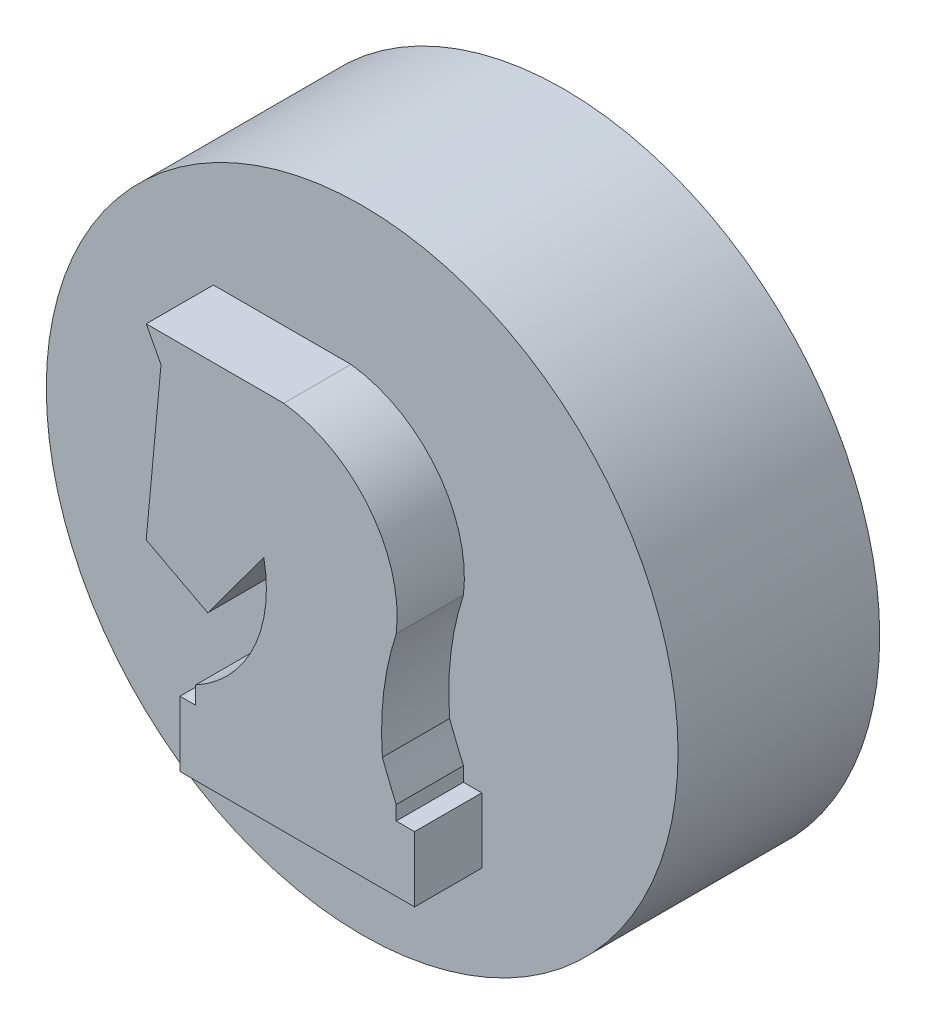
ISO-10303-21;
HEADER;
FILE_DESCRIPTION(('STEP AP214'),'2;1');
FILE_NAME('part.step','',(''),(''),'','','');
FILE_SCHEMA(('AUTOMOTIVE_DESIGN { 1 0 10303 214 1 1 1 1 }'));
ENDSEC;
DATA;
#1=APPLICATION_CONTEXT('core data for automotive mechanical design processes');
#2=APPLICATION_PROTOCOL_DEFINITION('international standard','automotive_design',2000,#1);
#3=PRODUCT_CONTEXT('',#1,'mechanical');
#4=PRODUCT('Part','Part','',(#3));
#5=PRODUCT_RELATED_PRODUCT_CATEGORY('part','',(#4));
#6=PRODUCT_DEFINITION_FORMATION('','',#4);
#7=PRODUCT_DEFINITION_CONTEXT('part definition',#1,'design');
#8=PRODUCT_DEFINITION('design','',#6,#7);
#9=PRODUCT_DEFINITION_SHAPE('','',#8);
#10=(LENGTH_UNIT() NAMED_UNIT(*) SI_UNIT(.MILLI.,.METRE.));
#11=(NAMED_UNIT(*) PLANE_ANGLE_UNIT() SI_UNIT($,.RADIAN.));
#12=(NAMED_UNIT(*) SI_UNIT($,.STERADIAN.) SOLID_ANGLE_UNIT());
#13=UNCERTAINTY_MEASURE_WITH_UNIT(LENGTH_MEASURE(1.E-05),#10,'distance_accuracy_value','');
#14=(GEOMETRIC_REPRESENTATION_CONTEXT(3) GLOBAL_UNCERTAINTY_ASSIGNED_CONTEXT((#13)) GLOBAL_UNIT_ASSIGNED_CONTEXT((#10,
#11,#12)) REPRESENTATION_CONTEXT('',''));
#15=CARTESIAN_POINT('',(0.,0.,0.));
#16=DIRECTION('',(0.,0.,1.));
#17=DIRECTION('',(1.,0.,0.));
#18=AXIS2_PLACEMENT_3D('',#15,#16,#17);
#19=CARTESIAN_POINT('',(0.,0.,7.62));
#20=DIRECTION('',(0.,0.,1.));
#21=DIRECTION('',(1.,0.,0.));
#22=AXIS2_PLACEMENT_3D('',#19,#20,#21);
#23=PLANE('',#22);
#24=CARTESIAN_POINT('',(0.,0.,7.62));
#25=DIRECTION('',(0.,0.,1.));
#26=DIRECTION('',(1.,0.,0.));
#27=AXIS2_PLACEMENT_3D('',#24,#25,#26);
#28=CIRCLE('',#27,11.938);
#29=CARTESIAN_POINT('',(11.938,0.,7.62));
#30=VERTEX_POINT('',#29);
#31=EDGE_CURVE('E289',#30,#30,#28,.T.);
#32=ORIENTED_EDGE('',*,*,#31,.T.);
#33=EDGE_LOOP('',(#32));
#34=FACE_BOUND('',#33,.T.);
#35=DIRECTION('',(1.,0.,0.));
#36=VECTOR('',#35,1.);
#37=CARTESIAN_POINT('',(-4.3442198431286,-7.49028113484514,7.62));
#38=LINE('',#37,#36);
#39=CARTESIAN_POINT('',(-4.3442198431286,-7.49028113484514,7.62));
#40=VERTEX_POINT('',#39);
#41=CARTESIAN_POINT('',(4.51955693668286,-7.49028113484514,7.62));
#42=VERTEX_POINT('',#41);
#43=EDGE_CURVE('E192',#40,#42,#38,.T.);
#44=ORIENTED_EDGE('',*,*,#43,.F.);
#45=DIRECTION('',(0.,-1.,0.));
#46=VECTOR('',#45,1.);
#47=CARTESIAN_POINT('',(-4.3442198431286,-7.49028113484514,7.62));
#48=LINE('',#47,#46);
#49=CARTESIAN_POINT('',(-4.3442198431286,-5.02591270278993,7.62));
#50=VERTEX_POINT('',#49);
#51=EDGE_CURVE('E188',#50,#40,#48,.T.);
#52=ORIENTED_EDGE('',*,*,#51,.F.);
#53=DIRECTION('',(-1.,0.,0.));
#54=VECTOR('',#53,1.);
#55=CARTESIAN_POINT('',(-4.3442198431286,-5.02591270278993,7.62));
#56=LINE('',#55,#54);
#57=CARTESIAN_POINT('',(-3.74977555423126,-5.02591270278993,7.62));
#58=VERTEX_POINT('',#57);
#59=EDGE_CURVE('E113',#58,#50,#56,.T.);
#60=ORIENTED_EDGE('',*,*,#59,.F.);
#61=DIRECTION('',(0.,-1.,0.));
#62=VECTOR('',#61,1.);
#63=CARTESIAN_POINT('',(-3.74977555423126,-5.02591270278993,7.62));
#64=LINE('',#63,#62);
#65=CARTESIAN_POINT('',(-3.74977555423126,-4.35773064341341,7.62));
#66=VERTEX_POINT('',#65);
#67=EDGE_CURVE('E230',#66,#58,#64,.T.);
#68=ORIENTED_EDGE('',*,*,#67,.F.);
#69=CARTESIAN_POINT('',(-6.15399043544653,0.111177912257103,7.62));
#70=DIRECTION('',(0.,0.,-1.));
#71=DIRECTION('',(1.,0.,0.));
#72=AXIS2_PLACEMENT_3D('',#69,#70,#71);
#73=CIRCLE('',#72,5.0745830246437);
#74=CARTESIAN_POINT('',(-1.17672871570882,1.10024749890693,7.62));
#75=VERTEX_POINT('',#74);
#76=EDGE_CURVE('E174',#75,#66,#73,.T.);
#77=ORIENTED_EDGE('',*,*,#76,.F.);
#78=DIRECTION('',(0.593571627985533,0.804781164323945,0.));
#79=VECTOR('',#78,1.);
#80=CARTESIAN_POINT('',(-1.17672871570882,1.10024749890693,7.62));
#81=LINE('',#80,#79);
#82=CARTESIAN_POINT('',(-3.29494404237123,-1.77168861883782,7.62));
#83=VERTEX_POINT('',#82);
#84=EDGE_CURVE('E225',#83,#75,#81,.T.);
#85=ORIENTED_EDGE('',*,*,#84,.F.);
#86=DIRECTION('',(0.885347007024132,-0.464930830504292,0.));
#87=VECTOR('',#86,1.);
#88=CARTESIAN_POINT('',(-3.29494404237123,-1.77168861883782,7.62));
#89=LINE('',#88,#87);
#90=CARTESIAN_POINT('',(-5.62108234588395,-0.550141129842317,7.62));
#91=VERTEX_POINT('',#90);
#92=EDGE_CURVE('E222',#91,#83,#89,.T.);
#93=ORIENTED_EDGE('',*,*,#92,.F.);
#94=DIRECTION('',(-0.092534059545022,-0.995709519801894,0.));
#95=VECTOR('',#94,1.);
#96=CARTESIAN_POINT('',(-5.62108234588395,-0.550141129842317,7.62));
#97=LINE('',#96,#95);
#98=CARTESIAN_POINT('',(-5.06228934559877,5.46273145694725,7.62));
#99=VERTEX_POINT('',#98);
#100=EDGE_CURVE('E219',#99,#91,#97,.T.);
#101=ORIENTED_EDGE('',*,*,#100,.F.);
#102=DIRECTION('',(0.466193211524105,-0.884682931636437,0.));
#103=VECTOR('',#102,1.);
#104=CARTESIAN_POINT('',(-5.06228934559877,5.46273145694725,7.62));
#105=LINE('',#104,#103);
#106=CARTESIAN_POINT('',(-5.62108234588395,6.52313863888377,7.62));
#107=VERTEX_POINT('',#106);
#108=EDGE_CURVE('E216',#107,#99,#105,.T.);
#109=ORIENTED_EDGE('',*,*,#108,.F.);
#110=DIRECTION('',(-1.,0.,0.));
#111=VECTOR('',#110,1.);
#112=CARTESIAN_POINT('',(-5.62108234588395,6.52313863888377,7.62));
#113=LINE('',#112,#111);
#114=CARTESIAN_POINT('',(-0.422811907853626,6.52313863888377,7.62));
#115=VERTEX_POINT('',#114);
#116=EDGE_CURVE('E213',#115,#107,#113,.T.);
#117=ORIENTED_EDGE('',*,*,#116,.F.);
#118=CARTESIAN_POINT('',(-1.00964256653949,1.68707815759279,7.62));
#119=DIRECTION('',(0.,0.,1.));
#120=DIRECTION('',(-1.,0.,0.));
#121=AXIS2_PLACEMENT_3D('',#118,#119,#120);
#122=CIRCLE('',#121,4.87153478902471);
#123=CARTESIAN_POINT('',(3.82641791475149,1.10024749890693,7.62));
#124=VERTEX_POINT('',#123);
#125=EDGE_CURVE('E210',#124,#115,#122,.T.);
#126=ORIENTED_EDGE('',*,*,#125,.F.);
#127=CARTESIAN_POINT('',(14.358196574168,-2.36006503648939,7.62));
#128=DIRECTION('',(0.,0.,-1.));
#129=DIRECTION('',(1.,0.,0.));
#130=AXIS2_PLACEMENT_3D('',#127,#128,#129);
#131=CIRCLE('',#130,11.0856720397801);
#132=CARTESIAN_POINT('',(3.30447312739715,-3.2010897304612,7.62));
#133=VERTEX_POINT('',#132);
#134=EDGE_CURVE('E207',#133,#124,#131,.T.);
#135=ORIENTED_EDGE('',*,*,#134,.F.);
#136=CARTESIAN_POINT('',(28.3416591436498,6.21763718591779,7.62));
#137=DIRECTION('',(0.,0.,-1.));
#138=DIRECTION('',(1.,0.,0.));
#139=AXIS2_PLACEMENT_3D('',#136,#137,#138);
#140=CIRCLE('',#139,26.7501981364205);
#141=CARTESIAN_POINT('',(3.82641791475149,-4.48638298533953,7.62));
#142=VERTEX_POINT('',#141);
#143=EDGE_CURVE('E204',#142,#133,#140,.T.);
#144=ORIENTED_EDGE('',*,*,#143,.F.);
#145=DIRECTION('',(0.,1.,0.));
#146=VECTOR('',#145,1.);
#147=CARTESIAN_POINT('',(3.82641791475149,-4.48638298533953,7.62));
#148=LINE('',#147,#146);
#149=CARTESIAN_POINT('',(3.82641791475149,-5.02591270278993,7.62));
#150=VERTEX_POINT('',#149);
#151=EDGE_CURVE('E201',#150,#142,#148,.T.);
#152=ORIENTED_EDGE('',*,*,#151,.F.);
#153=DIRECTION('',(-1.,0.,0.));
#154=VECTOR('',#153,1.);
#155=CARTESIAN_POINT('',(3.82641791475149,-5.02591270278993,7.62));
#156=LINE('',#155,#154);
#157=CARTESIAN_POINT('',(4.51955693668286,-5.02591270278993,7.62));
#158=VERTEX_POINT('',#157);
#159=EDGE_CURVE('E198',#158,#150,#156,.T.);
#160=ORIENTED_EDGE('',*,*,#159,.F.);
#161=DIRECTION('',(0.,1.,0.));
#162=VECTOR('',#161,1.);
#163=CARTESIAN_POINT('',(4.51955693668286,-7.49028113484514,7.62));
#164=LINE('',#163,#162);
#165=EDGE_CURVE('E195',#42,#158,#164,.T.);
#166=ORIENTED_EDGE('',*,*,#165,.F.);
#167=EDGE_LOOP('',(#44,#52,#60,#68,#77,#85,#93,#101,#109,#117,#126,#135,#144,#152,#160,#166));
#168=FACE_BOUND('',#167,.T.);
#169=ADVANCED_FACE('F39',(#34,#168),#23,.T.);
#170=CARTESIAN_POINT('',(0.,0.,0.));
#171=DIRECTION('',(0.,0.,1.));
#172=DIRECTION('',(1.,0.,0.));
#173=AXIS2_PLACEMENT_3D('',#170,#171,#172);
#174=PLANE('',#173);
#175=CARTESIAN_POINT('',(0.,0.,0.));
#176=DIRECTION('',(0.,0.,1.));
#177=DIRECTION('',(1.,0.,0.));
#178=AXIS2_PLACEMENT_3D('',#175,#176,#177);
#179=CIRCLE('',#178,11.938);
#180=CARTESIAN_POINT('',(11.938,0.,0.));
#181=VERTEX_POINT('',#180);
#182=EDGE_CURVE('E11',#181,#181,#179,.T.);
#183=ORIENTED_EDGE('',*,*,#182,.F.);
#184=EDGE_LOOP('',(#183));
#185=FACE_BOUND('',#184,.T.);
#186=CARTESIAN_POINT('',(0.,0.,0.));
#187=DIRECTION('',(0.,0.,1.));
#188=DIRECTION('',(1.,0.,0.));
#189=AXIS2_PLACEMENT_3D('',#186,#187,#188);
#190=CIRCLE('',#189,8.763);
#191=CARTESIAN_POINT('',(8.763,0.,0.));
#192=VERTEX_POINT('',#191);
#193=EDGE_CURVE('E48',#192,#192,#190,.T.);
#194=ORIENTED_EDGE('',*,*,#193,.T.);
#195=EDGE_LOOP('',(#194));
#196=FACE_BOUND('',#195,.T.);
#197=ADVANCED_FACE('F300',(#185,#196),#174,.F.);
#198=CARTESIAN_POINT('',(0.,0.,5.08));
#199=DIRECTION('',(0.,0.,-1.));
#200=DIRECTION('',(-1.,0.,0.));
#201=AXIS2_PLACEMENT_3D('',#198,#199,#200);
#202=CYLINDRICAL_SURFACE('',#201,11.938);
#203=ORIENTED_EDGE('',*,*,#182,.T.);
#204=EDGE_LOOP('',(#203));
#205=FACE_BOUND('',#204,.T.);
#206=ORIENTED_EDGE('',*,*,#31,.F.);
#207=EDGE_LOOP('',(#206));
#208=FACE_BOUND('',#207,.T.);
#209=ADVANCED_FACE('F41',(#205,#208),#202,.T.);
#210=CARTESIAN_POINT('',(0.,0.,5.08));
#211=DIRECTION('',(0.,0.,-1.));
#212=DIRECTION('',(-1.,0.,0.));
#213=AXIS2_PLACEMENT_3D('',#210,#211,#212);
#214=CYLINDRICAL_SURFACE('',#213,8.763);
#215=CARTESIAN_POINT('',(0.,0.,5.08));
#216=DIRECTION('',(0.,0.,1.));
#217=DIRECTION('',(1.,0.,0.));
#218=AXIS2_PLACEMENT_3D('',#215,#216,#217);
#219=CIRCLE('',#218,8.763);
#220=CARTESIAN_POINT('',(8.763,0.,5.08));
#221=VERTEX_POINT('',#220);
#222=EDGE_CURVE('E293',#221,#221,#219,.T.);
#223=ORIENTED_EDGE('',*,*,#222,.T.);
#224=EDGE_LOOP('',(#223));
#225=FACE_BOUND('',#224,.T.);
#226=ORIENTED_EDGE('',*,*,#193,.F.);
#227=EDGE_LOOP('',(#226));
#228=FACE_BOUND('',#227,.T.);
#229=ADVANCED_FACE('F302',(#225,#228),#214,.F.);
#230=CARTESIAN_POINT('',(0.,0.,5.08));
#231=DIRECTION('',(0.,0.,1.));
#232=DIRECTION('',(1.,0.,0.));
#233=AXIS2_PLACEMENT_3D('',#230,#231,#232);
#234=PLANE('',#233);
#235=ORIENTED_EDGE('',*,*,#222,.F.);
#236=EDGE_LOOP('',(#235));
#237=FACE_BOUND('',#236,.T.);
#238=ADVANCED_FACE('F304',(#237),#234,.F.);
#239=CARTESIAN_POINT('',(-4.3442198431286,-7.49028113484514,10.16));
#240=DIRECTION('',(1.,0.,0.));
#241=DIRECTION('',(0.,0.,-1.));
#242=AXIS2_PLACEMENT_3D('',#239,#240,#241);
#243=PLANE('',#242);
#244=ORIENTED_EDGE('',*,*,#51,.T.);
#245=DIRECTION('',(0.,0.,-1.));
#246=VECTOR('',#245,1.);
#247=CARTESIAN_POINT('',(-4.3442198431286,-7.49028113484514,10.16));
#248=LINE('',#247,#246);
#249=CARTESIAN_POINT('',(-4.3442198431286,-7.49028113484514,10.16));
#250=VERTEX_POINT('',#249);
#251=EDGE_CURVE('E286',#250,#40,#248,.T.);
#252=ORIENTED_EDGE('',*,*,#251,.F.);
#253=DIRECTION('',(0.,-1.,0.));
#254=VECTOR('',#253,1.);
#255=CARTESIAN_POINT('',(-4.3442198431286,-7.49028113484514,10.16));
#256=LINE('',#255,#254);
#257=CARTESIAN_POINT('',(-4.3442198431286,-5.02591270278993,10.16));
#258=VERTEX_POINT('',#257);
#259=EDGE_CURVE('E235',#258,#250,#256,.T.);
#260=ORIENTED_EDGE('',*,*,#259,.F.);
#261=DIRECTION('',(0.,0.,-1.));
#262=VECTOR('',#261,1.);
#263=CARTESIAN_POINT('',(-4.3442198431286,-5.02591270278993,10.16));
#264=LINE('',#263,#262);
#265=EDGE_CURVE('E184',#258,#50,#264,.T.);
#266=ORIENTED_EDGE('',*,*,#265,.T.);
#267=EDGE_LOOP('',(#244,#252,#260,#266));
#268=FACE_BOUND('',#267,.T.);
#269=ADVANCED_FACE('F311',(#268),#243,.F.);
#270=CARTESIAN_POINT('',(-4.3442198431286,-7.49028113484514,10.16));
#271=DIRECTION('',(0.,1.,0.));
#272=DIRECTION('',(0.,0.,1.));
#273=AXIS2_PLACEMENT_3D('',#270,#271,#272);
#274=PLANE('',#273);
#275=ORIENTED_EDGE('',*,*,#43,.T.);
#276=DIRECTION('',(0.,0.,-1.));
#277=VECTOR('',#276,1.);
#278=CARTESIAN_POINT('',(4.51955693668286,-7.49028113484514,10.16));
#279=LINE('',#278,#277);
#280=CARTESIAN_POINT('',(4.51955693668286,-7.49028113484514,10.16));
#281=VERTEX_POINT('',#280);
#282=EDGE_CURVE('E282',#281,#42,#279,.T.);
#283=ORIENTED_EDGE('',*,*,#282,.F.);
#284=DIRECTION('',(1.,0.,0.));
#285=VECTOR('',#284,1.);
#286=CARTESIAN_POINT('',(-4.3442198431286,-7.49028113484514,10.16));
#287=LINE('',#286,#285);
#288=EDGE_CURVE('E121',#250,#281,#287,.T.);
#289=ORIENTED_EDGE('',*,*,#288,.F.);
#290=ORIENTED_EDGE('',*,*,#251,.T.);
#291=EDGE_LOOP('',(#275,#283,#289,#290));
#292=FACE_BOUND('',#291,.T.);
#293=ADVANCED_FACE('F326',(#292),#274,.F.);
#294=CARTESIAN_POINT('',(4.51955693668286,-7.49028113484514,10.16));
#295=DIRECTION('',(-1.,0.,0.));
#296=DIRECTION('',(0.,0.,1.));
#297=AXIS2_PLACEMENT_3D('',#294,#295,#296);
#298=PLANE('',#297);
#299=ORIENTED_EDGE('',*,*,#165,.T.);
#300=DIRECTION('',(0.,0.,-1.));
#301=VECTOR('',#300,1.);
#302=CARTESIAN_POINT('',(4.51955693668286,-5.02591270278993,10.16));
#303=LINE('',#302,#301);
#304=CARTESIAN_POINT('',(4.51955693668286,-5.02591270278993,10.16));
#305=VERTEX_POINT('',#304);
#306=EDGE_CURVE('E278',#305,#158,#303,.T.);
#307=ORIENTED_EDGE('',*,*,#306,.F.);
#308=DIRECTION('',(0.,1.,0.));
#309=VECTOR('',#308,1.);
#310=CARTESIAN_POINT('',(4.51955693668286,-7.49028113484514,10.16));
#311=LINE('',#310,#309);
#312=EDGE_CURVE('E524',#281,#305,#311,.T.);
#313=ORIENTED_EDGE('',*,*,#312,.F.);
#314=ORIENTED_EDGE('',*,*,#282,.T.);
#315=EDGE_LOOP('',(#299,#307,#313,#314));
#316=FACE_BOUND('',#315,.T.);
#317=ADVANCED_FACE('F330',(#316),#298,.F.);
#318=CARTESIAN_POINT('',(3.82641791475149,-5.02591270278993,10.16));
#319=DIRECTION('',(0.,-1.,0.));
#320=DIRECTION('',(0.,0.,-1.));
#321=AXIS2_PLACEMENT_3D('',#318,#319,#320);
#322=PLANE('',#321);
#323=ORIENTED_EDGE('',*,*,#159,.T.);
#324=DIRECTION('',(0.,0.,-1.));
#325=VECTOR('',#324,1.);
#326=CARTESIAN_POINT('',(3.82641791475149,-5.02591270278993,10.16));
#327=LINE('',#326,#325);
#328=CARTESIAN_POINT('',(3.82641791475149,-5.02591270278993,10.16));
#329=VERTEX_POINT('',#328);
#330=EDGE_CURVE('E274',#329,#150,#327,.T.);
#331=ORIENTED_EDGE('',*,*,#330,.F.);
#332=DIRECTION('',(-1.,0.,0.));
#333=VECTOR('',#332,1.);
#334=CARTESIAN_POINT('',(3.82641791475149,-5.02591270278993,10.16));
#335=LINE('',#334,#333);
#336=EDGE_CURVE('E529',#305,#329,#335,.T.);
#337=ORIENTED_EDGE('',*,*,#336,.F.);
#338=ORIENTED_EDGE('',*,*,#306,.T.);
#339=EDGE_LOOP('',(#323,#331,#337,#338));
#340=FACE_BOUND('',#339,.T.);
#341=ADVANCED_FACE('F333',(#340),#322,.F.);
#342=CARTESIAN_POINT('',(3.82641791475149,-4.48638298533953,10.16));
#343=DIRECTION('',(-1.,0.,0.));
#344=DIRECTION('',(0.,0.,1.));
#345=AXIS2_PLACEMENT_3D('',#342,#343,#344);
#346=PLANE('',#345);
#347=ORIENTED_EDGE('',*,*,#151,.T.);
#348=DIRECTION('',(0.,0.,-1.));
#349=VECTOR('',#348,1.);
#350=CARTESIAN_POINT('',(3.82641791475149,-4.48638298533953,10.16));
#351=LINE('',#350,#349);
#352=CARTESIAN_POINT('',(3.82641791475149,-4.48638298533953,10.16));
#353=VERTEX_POINT('',#352);
#354=EDGE_CURVE('E270',#353,#142,#351,.T.);
#355=ORIENTED_EDGE('',*,*,#354,.F.);
#356=DIRECTION('',(0.,1.,0.));
#357=VECTOR('',#356,1.);
#358=CARTESIAN_POINT('',(3.82641791475149,-4.48638298533953,10.16));
#359=LINE('',#358,#357);
#360=EDGE_CURVE('E532',#329,#353,#359,.T.);
#361=ORIENTED_EDGE('',*,*,#360,.F.);
#362=ORIENTED_EDGE('',*,*,#330,.T.);
#363=EDGE_LOOP('',(#347,#355,#361,#362));
#364=FACE_BOUND('',#363,.T.);
#365=ADVANCED_FACE('F337',(#364),#346,.F.);
#366=CARTESIAN_POINT('',(28.3416591436498,6.21763718591779,10.16));
#367=DIRECTION('',(0.,0.,-1.));
#368=DIRECTION('',(-1.,0.,0.));
#369=AXIS2_PLACEMENT_3D('',#366,#367,#368);
#370=CYLINDRICAL_SURFACE('',#369,26.7501981364205);
#371=ORIENTED_EDGE('',*,*,#143,.T.);
#372=DIRECTION('',(0.,0.,-1.));
#373=VECTOR('',#372,1.);
#374=CARTESIAN_POINT('',(3.30447312739715,-3.2010897304612,10.16));
#375=LINE('',#374,#373);
#376=CARTESIAN_POINT('',(3.30447312739715,-3.2010897304612,10.16));
#377=VERTEX_POINT('',#376);
#378=EDGE_CURVE('E266',#377,#133,#375,.T.);
#379=ORIENTED_EDGE('',*,*,#378,.F.);
#380=CARTESIAN_POINT('',(28.3416591436498,6.21763718591779,10.16));
#381=DIRECTION('',(0.,0.,-1.));
#382=DIRECTION('',(1.,0.,0.));
#383=AXIS2_PLACEMENT_3D('',#380,#381,#382);
#384=CIRCLE('',#383,26.7501981364205);
#385=EDGE_CURVE('E535',#353,#377,#384,.T.);
#386=ORIENTED_EDGE('',*,*,#385,.F.);
#387=ORIENTED_EDGE('',*,*,#354,.T.);
#388=EDGE_LOOP('',(#371,#379,#386,#387));
#389=FACE_BOUND('',#388,.T.);
#390=ADVANCED_FACE('F341',(#389),#370,.F.);
#391=CARTESIAN_POINT('',(14.358196574168,-2.36006503648939,10.16));
#392=DIRECTION('',(0.,0.,-1.));
#393=DIRECTION('',(-1.,0.,0.));
#394=AXIS2_PLACEMENT_3D('',#391,#392,#393);
#395=CYLINDRICAL_SURFACE('',#394,11.0856720397801);
#396=ORIENTED_EDGE('',*,*,#134,.T.);
#397=DIRECTION('',(0.,0.,-1.));
#398=VECTOR('',#397,1.);
#399=CARTESIAN_POINT('',(3.82641791475149,1.10024749890693,10.16));
#400=LINE('',#399,#398);
#401=CARTESIAN_POINT('',(3.82641791475149,1.10024749890693,10.16));
#402=VERTEX_POINT('',#401);
#403=EDGE_CURVE('E262',#402,#124,#400,.T.);
#404=ORIENTED_EDGE('',*,*,#403,.F.);
#405=CARTESIAN_POINT('',(14.358196574168,-2.36006503648939,10.16));
#406=DIRECTION('',(0.,0.,-1.));
#407=DIRECTION('',(1.,0.,0.));
#408=AXIS2_PLACEMENT_3D('',#405,#406,#407);
#409=CIRCLE('',#408,11.0856720397801);
#410=EDGE_CURVE('E538',#377,#402,#409,.T.);
#411=ORIENTED_EDGE('',*,*,#410,.F.);
#412=ORIENTED_EDGE('',*,*,#378,.T.);
#413=EDGE_LOOP('',(#396,#404,#411,#412));
#414=FACE_BOUND('',#413,.T.);
#415=ADVANCED_FACE('F345',(#414),#395,.F.);
#416=CARTESIAN_POINT('',(-1.00964256653949,1.68707815759279,10.16));
#417=DIRECTION('',(0.,0.,-1.));
#418=DIRECTION('',(-1.,0.,0.));
#419=AXIS2_PLACEMENT_3D('',#416,#417,#418);
#420=CYLINDRICAL_SURFACE('',#419,4.87153478902471);
#421=ORIENTED_EDGE('',*,*,#125,.T.);
#422=DIRECTION('',(0.,0.,-1.));
#423=VECTOR('',#422,1.);
#424=CARTESIAN_POINT('',(-0.422811907853626,6.52313863888377,10.16));
#425=LINE('',#424,#423);
#426=CARTESIAN_POINT('',(-0.422811907853626,6.52313863888377,10.16));
#427=VERTEX_POINT('',#426);
#428=EDGE_CURVE('E258',#427,#115,#425,.T.);
#429=ORIENTED_EDGE('',*,*,#428,.F.);
#430=CARTESIAN_POINT('',(-1.00964256653949,1.68707815759279,10.16));
#431=DIRECTION('',(0.,0.,1.));
#432=DIRECTION('',(-1.,0.,0.));
#433=AXIS2_PLACEMENT_3D('',#430,#431,#432);
#434=CIRCLE('',#433,4.87153478902471);
#435=EDGE_CURVE('E541',#402,#427,#434,.T.);
#436=ORIENTED_EDGE('',*,*,#435,.F.);
#437=ORIENTED_EDGE('',*,*,#403,.T.);
#438=EDGE_LOOP('',(#421,#429,#436,#437));
#439=FACE_BOUND('',#438,.T.);
#440=ADVANCED_FACE('F349',(#439),#420,.T.);
#441=CARTESIAN_POINT('',(-5.62108234588395,6.52313863888377,10.16));
#442=DIRECTION('',(0.,-1.,0.));
#443=DIRECTION('',(0.,0.,-1.));
#444=AXIS2_PLACEMENT_3D('',#441,#442,#443);
#445=PLANE('',#444);
#446=ORIENTED_EDGE('',*,*,#116,.T.);
#447=DIRECTION('',(0.,0.,-1.));
#448=VECTOR('',#447,1.);
#449=CARTESIAN_POINT('',(-5.62108234588395,6.52313863888377,10.16));
#450=LINE('',#449,#448);
#451=CARTESIAN_POINT('',(-5.62108234588395,6.52313863888377,10.16));
#452=VERTEX_POINT('',#451);
#453=EDGE_CURVE('E254',#452,#107,#450,.T.);
#454=ORIENTED_EDGE('',*,*,#453,.F.);
#455=DIRECTION('',(-1.,0.,0.));
#456=VECTOR('',#455,1.);
#457=CARTESIAN_POINT('',(-5.62108234588395,6.52313863888377,10.16));
#458=LINE('',#457,#456);
#459=EDGE_CURVE('E544',#427,#452,#458,.T.);
#460=ORIENTED_EDGE('',*,*,#459,.F.);
#461=ORIENTED_EDGE('',*,*,#428,.T.);
#462=EDGE_LOOP('',(#446,#454,#460,#461));
#463=FACE_BOUND('',#462,.T.);
#464=ADVANCED_FACE('F353',(#463),#445,.F.);
#465=CARTESIAN_POINT('',(-5.06228934559877,5.46273145694725,10.16));
#466=DIRECTION('',(0.884682931636437,0.466193211524105,0.));
#467=DIRECTION('',(-0.466193211524105,0.884682931636437,0.));
#468=AXIS2_PLACEMENT_3D('',#465,#466,#467);
#469=PLANE('',#468);
#470=ORIENTED_EDGE('',*,*,#108,.T.);
#471=DIRECTION('',(0.,0.,-1.));
#472=VECTOR('',#471,1.);
#473=CARTESIAN_POINT('',(-5.06228934559877,5.46273145694725,10.16));
#474=LINE('',#473,#472);
#475=CARTESIAN_POINT('',(-5.06228934559877,5.46273145694725,10.16));
#476=VERTEX_POINT('',#475);
#477=EDGE_CURVE('E250',#476,#99,#474,.T.);
#478=ORIENTED_EDGE('',*,*,#477,.F.);
#479=DIRECTION('',(0.466193211524105,-0.884682931636437,0.));
#480=VECTOR('',#479,1.);
#481=CARTESIAN_POINT('',(-5.06228934559877,5.46273145694725,10.16));
#482=LINE('',#481,#480);
#483=EDGE_CURVE('E547',#452,#476,#482,.T.);
#484=ORIENTED_EDGE('',*,*,#483,.F.);
#485=ORIENTED_EDGE('',*,*,#453,.T.);
#486=EDGE_LOOP('',(#470,#478,#484,#485));
#487=FACE_BOUND('',#486,.T.);
#488=ADVANCED_FACE('F357',(#487),#469,.F.);
#489=CARTESIAN_POINT('',(-5.62108234588395,-0.550141129842317,10.16));
#490=DIRECTION('',(0.995709519801894,-0.092534059545022,0.));
#491=DIRECTION('',(0.092534059545022,0.995709519801894,0.));
#492=AXIS2_PLACEMENT_3D('',#489,#490,#491);
#493=PLANE('',#492);
#494=ORIENTED_EDGE('',*,*,#100,.T.);
#495=DIRECTION('',(0.,0.,-1.));
#496=VECTOR('',#495,1.);
#497=CARTESIAN_POINT('',(-5.62108234588395,-0.550141129842317,10.16));
#498=LINE('',#497,#496);
#499=CARTESIAN_POINT('',(-5.62108234588395,-0.550141129842317,10.16));
#500=VERTEX_POINT('',#499);
#501=EDGE_CURVE('E246',#500,#91,#498,.T.);
#502=ORIENTED_EDGE('',*,*,#501,.F.);
#503=DIRECTION('',(-0.092534059545022,-0.995709519801894,0.));
#504=VECTOR('',#503,1.);
#505=CARTESIAN_POINT('',(-5.62108234588395,-0.550141129842317,10.16));
#506=LINE('',#505,#504);
#507=EDGE_CURVE('E550',#476,#500,#506,.T.);
#508=ORIENTED_EDGE('',*,*,#507,.F.);
#509=ORIENTED_EDGE('',*,*,#477,.T.);
#510=EDGE_LOOP('',(#494,#502,#508,#509));
#511=FACE_BOUND('',#510,.T.);
#512=ADVANCED_FACE('F361',(#511),#493,.F.);
#513=CARTESIAN_POINT('',(-3.29494404237123,-1.77168861883782,10.16));
#514=DIRECTION('',(0.464930830504292,0.885347007024132,0.));
#515=DIRECTION('',(-0.885347007024133,0.464930830504292,0.));
#516=AXIS2_PLACEMENT_3D('',#513,#514,#515);
#517=PLANE('',#516);
#518=ORIENTED_EDGE('',*,*,#92,.T.);
#519=DIRECTION('',(0.,0.,-1.));
#520=VECTOR('',#519,1.);
#521=CARTESIAN_POINT('',(-3.29494404237123,-1.77168861883782,10.16));
#522=LINE('',#521,#520);
#523=CARTESIAN_POINT('',(-3.29494404237123,-1.77168861883782,10.16));
#524=VERTEX_POINT('',#523);
#525=EDGE_CURVE('E242',#524,#83,#522,.T.);
#526=ORIENTED_EDGE('',*,*,#525,.F.);
#527=DIRECTION('',(0.885347007024132,-0.464930830504292,0.));
#528=VECTOR('',#527,1.);
#529=CARTESIAN_POINT('',(-3.29494404237123,-1.77168861883782,10.16));
#530=LINE('',#529,#528);
#531=EDGE_CURVE('E553',#500,#524,#530,.T.);
#532=ORIENTED_EDGE('',*,*,#531,.F.);
#533=ORIENTED_EDGE('',*,*,#501,.T.);
#534=EDGE_LOOP('',(#518,#526,#532,#533));
#535=FACE_BOUND('',#534,.T.);
#536=ADVANCED_FACE('F365',(#535),#517,.F.);
#537=CARTESIAN_POINT('',(-1.17672871570882,1.10024749890693,10.16));
#538=DIRECTION('',(-0.804781164323945,0.593571627985533,0.));
#539=DIRECTION('',(-0.593571627985533,-0.804781164323945,0.));
#540=AXIS2_PLACEMENT_3D('',#537,#538,#539);
#541=PLANE('',#540);
#542=ORIENTED_EDGE('',*,*,#84,.T.);
#543=DIRECTION('',(0.,0.,-1.));
#544=VECTOR('',#543,1.);
#545=CARTESIAN_POINT('',(-1.17672871570882,1.10024749890693,10.16));
#546=LINE('',#545,#544);
#547=CARTESIAN_POINT('',(-1.17672871570882,1.10024749890693,10.16));
#548=VERTEX_POINT('',#547);
#549=EDGE_CURVE('E178',#548,#75,#546,.T.);
#550=ORIENTED_EDGE('',*,*,#549,.F.);
#551=DIRECTION('',(0.593571627985533,0.804781164323945,0.));
#552=VECTOR('',#551,1.);
#553=CARTESIAN_POINT('',(-1.17672871570882,1.10024749890693,10.16));
#554=LINE('',#553,#552);
#555=EDGE_CURVE('E164',#524,#548,#554,.T.);
#556=ORIENTED_EDGE('',*,*,#555,.F.);
#557=ORIENTED_EDGE('',*,*,#525,.T.);
#558=EDGE_LOOP('',(#542,#550,#556,#557));
#559=FACE_BOUND('',#558,.T.);
#560=ADVANCED_FACE('F369',(#559),#541,.F.);
#561=CARTESIAN_POINT('',(-6.15399043544653,0.111177912257103,10.16));
#562=DIRECTION('',(0.,0.,-1.));
#563=DIRECTION('',(-1.,0.,0.));
#564=AXIS2_PLACEMENT_3D('',#561,#562,#563);
#565=CYLINDRICAL_SURFACE('',#564,5.0745830246437);
#566=ORIENTED_EDGE('',*,*,#76,.T.);
#567=DIRECTION('',(0.,0.,-1.));
#568=VECTOR('',#567,1.);
#569=CARTESIAN_POINT('',(-3.74977555423126,-4.35773064341341,10.16));
#570=LINE('',#569,#568);
#571=CARTESIAN_POINT('',(-3.74977555423126,-4.35773064341341,10.16));
#572=VERTEX_POINT('',#571);
#573=EDGE_CURVE('E171',#572,#66,#570,.T.);
#574=ORIENTED_EDGE('',*,*,#573,.F.);
#575=CARTESIAN_POINT('',(-6.15399043544653,0.111177912257103,10.16));
#576=DIRECTION('',(0.,0.,-1.));
#577=DIRECTION('',(1.,0.,0.));
#578=AXIS2_PLACEMENT_3D('',#575,#576,#577);
#579=CIRCLE('',#578,5.0745830246437);
#580=EDGE_CURVE('E158',#548,#572,#579,.T.);
#581=ORIENTED_EDGE('',*,*,#580,.F.);
#582=ORIENTED_EDGE('',*,*,#549,.T.);
#583=EDGE_LOOP('',(#566,#574,#581,#582));
#584=FACE_BOUND('',#583,.T.);
#585=ADVANCED_FACE('F172',(#584),#565,.F.);
#586=CARTESIAN_POINT('',(-3.74977555423126,-5.02591270278993,10.16));
#587=DIRECTION('',(1.,0.,0.));
#588=DIRECTION('',(0.,0.,-1.));
#589=AXIS2_PLACEMENT_3D('',#586,#587,#588);
#590=PLANE('',#589);
#591=ORIENTED_EDGE('',*,*,#67,.T.);
#592=DIRECTION('',(0.,0.,-1.));
#593=VECTOR('',#592,1.);
#594=CARTESIAN_POINT('',(-3.74977555423126,-5.02591270278993,10.16));
#595=LINE('',#594,#593);
#596=CARTESIAN_POINT('',(-3.74977555423126,-5.02591270278993,10.16));
#597=VERTEX_POINT('',#596);
#598=EDGE_CURVE('E55',#597,#58,#595,.T.);
#599=ORIENTED_EDGE('',*,*,#598,.F.);
#600=DIRECTION('',(0.,-1.,0.));
#601=VECTOR('',#600,1.);
#602=CARTESIAN_POINT('',(-3.74977555423126,-5.02591270278993,10.16));
#603=LINE('',#602,#601);
#604=EDGE_CURVE('E162',#572,#597,#603,.T.);
#605=ORIENTED_EDGE('',*,*,#604,.F.);
#606=ORIENTED_EDGE('',*,*,#573,.T.);
#607=EDGE_LOOP('',(#591,#599,#605,#606));
#608=FACE_BOUND('',#607,.T.);
#609=ADVANCED_FACE('F180',(#608),#590,.F.);
#610=CARTESIAN_POINT('',(-4.3442198431286,-5.02591270278993,10.16));
#611=DIRECTION('',(0.,-1.,0.));
#612=DIRECTION('',(0.,0.,-1.));
#613=AXIS2_PLACEMENT_3D('',#610,#611,#612);
#614=PLANE('',#613);
#615=ORIENTED_EDGE('',*,*,#59,.T.);
#616=ORIENTED_EDGE('',*,*,#265,.F.);
#617=DIRECTION('',(-1.,0.,0.));
#618=VECTOR('',#617,1.);
#619=CARTESIAN_POINT('',(-4.3442198431286,-5.02591270278993,10.16));
#620=LINE('',#619,#618);
#621=EDGE_CURVE('E63',#597,#258,#620,.T.);
#622=ORIENTED_EDGE('',*,*,#621,.F.);
#623=ORIENTED_EDGE('',*,*,#598,.T.);
#624=EDGE_LOOP('',(#615,#616,#622,#623));
#625=FACE_BOUND('',#624,.T.);
#626=ADVANCED_FACE('F378',(#625),#614,.F.);
#627=CARTESIAN_POINT('',(-6.15399043544653,0.111177912257103,10.16));
#628=DIRECTION('',(0.,0.,1.));
#629=DIRECTION('',(1.,0.,0.));
#630=AXIS2_PLACEMENT_3D('',#627,#628,#629);
#631=PLANE('',#630);
#632=ORIENTED_EDGE('',*,*,#259,.T.);
#633=ORIENTED_EDGE('',*,*,#288,.T.);
#634=ORIENTED_EDGE('',*,*,#312,.T.);
#635=ORIENTED_EDGE('',*,*,#336,.T.);
#636=ORIENTED_EDGE('',*,*,#360,.T.);
#637=ORIENTED_EDGE('',*,*,#385,.T.);
#638=ORIENTED_EDGE('',*,*,#410,.T.);
#639=ORIENTED_EDGE('',*,*,#435,.T.);
#640=ORIENTED_EDGE('',*,*,#459,.T.);
#641=ORIENTED_EDGE('',*,*,#483,.T.);
#642=ORIENTED_EDGE('',*,*,#507,.T.);
#643=ORIENTED_EDGE('',*,*,#531,.T.);
#644=ORIENTED_EDGE('',*,*,#555,.T.);
#645=ORIENTED_EDGE('',*,*,#580,.T.);
#646=ORIENTED_EDGE('',*,*,#604,.T.);
#647=ORIENTED_EDGE('',*,*,#621,.T.);
#648=EDGE_LOOP('',(#632,#633,#634,#635,#636,#637,#638,#639,#640,#641,#642,#643,#644,#645,#646,#647));
#649=FACE_BOUND('',#648,.T.);
#650=ADVANCED_FACE('F160',(#649),#631,.T.);
#651=CLOSED_SHELL('',(#169,#197,#209,#229,#238,#269,#293,#317,#341,#365,#390,#415,#440,#464,
#488,#512,#536,#560,#585,#609,#626,#650));
#652=MANIFOLD_SOLID_BREP('B2',#651);
#653=ADVANCED_BREP_SHAPE_REPRESENTATION('',(#18,#652),#14);
#654=SHAPE_DEFINITION_REPRESENTATION(#9,#653);
ENDSEC;
END-ISO-10303-21;
